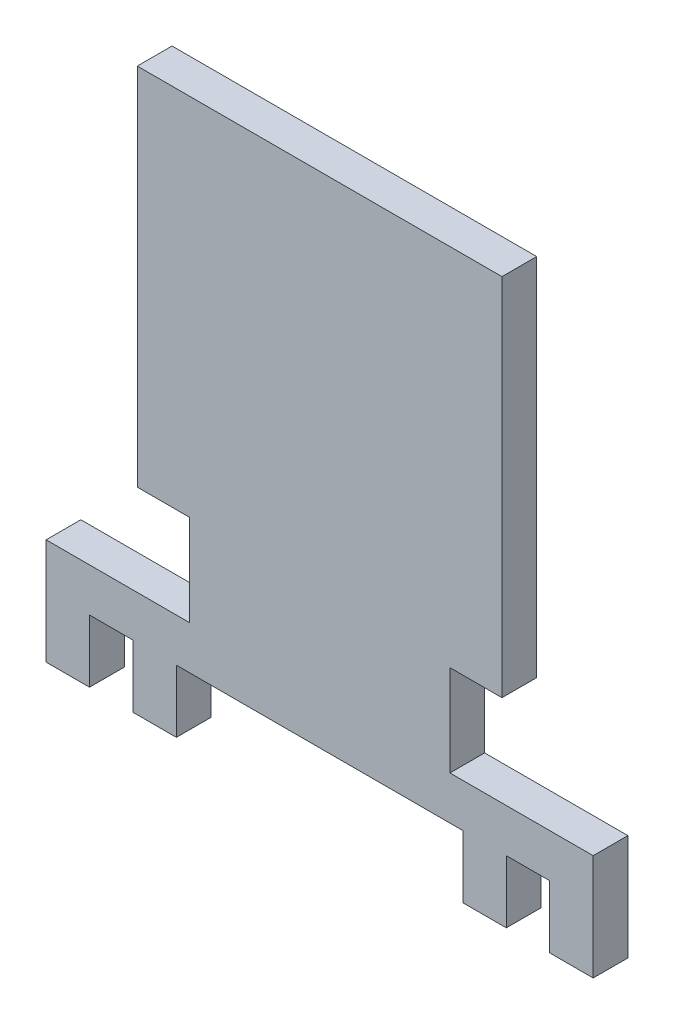
ISO-10303-21;
HEADER;
FILE_DESCRIPTION(('STEP AP214'),'2;1');
FILE_NAME('part.step','',(''),(''),'','','');
FILE_SCHEMA(('AUTOMOTIVE_DESIGN { 1 0 10303 214 1 1 1 1 }'));
ENDSEC;
DATA;
#1=APPLICATION_CONTEXT('core data for automotive mechanical design processes');
#2=APPLICATION_PROTOCOL_DEFINITION('international standard','automotive_design',2000,#1);
#3=PRODUCT_CONTEXT('',#1,'mechanical');
#4=PRODUCT('Part','Part','',(#3));
#5=PRODUCT_RELATED_PRODUCT_CATEGORY('part','',(#4));
#6=PRODUCT_DEFINITION_FORMATION('','',#4);
#7=PRODUCT_DEFINITION_CONTEXT('part definition',#1,'design');
#8=PRODUCT_DEFINITION('design','',#6,#7);
#9=PRODUCT_DEFINITION_SHAPE('','',#8);
#10=(LENGTH_UNIT() NAMED_UNIT(*) SI_UNIT(.MILLI.,.METRE.));
#11=(NAMED_UNIT(*) PLANE_ANGLE_UNIT() SI_UNIT($,.RADIAN.));
#12=(NAMED_UNIT(*) SI_UNIT($,.STERADIAN.) SOLID_ANGLE_UNIT());
#13=UNCERTAINTY_MEASURE_WITH_UNIT(LENGTH_MEASURE(1.E-05),#10,'distance_accuracy_value','');
#14=(GEOMETRIC_REPRESENTATION_CONTEXT(3) GLOBAL_UNCERTAINTY_ASSIGNED_CONTEXT((#13)) GLOBAL_UNIT_ASSIGNED_CONTEXT((#10,
#11,#12)) REPRESENTATION_CONTEXT('',''));
#15=CARTESIAN_POINT('',(0.,0.,0.));
#16=DIRECTION('',(0.,0.,1.));
#17=DIRECTION('',(1.,0.,0.));
#18=AXIS2_PLACEMENT_3D('',#15,#16,#17);
#19=CARTESIAN_POINT('',(-8.28702779116465,-15.9082329317269,5.08));
#20=DIRECTION('',(0.,1.,0.));
#21=DIRECTION('',(-1.,0.,0.));
#22=AXIS2_PLACEMENT_3D('',#19,#20,#21);
#23=PLANE('',#22);
#24=DIRECTION('',(1.,0.,0.));
#25=VECTOR('',#24,1.);
#26=CARTESIAN_POINT('',(-8.28702779116465,-15.9082329317269,5.08));
#27=LINE('',#26,#25);
#28=CARTESIAN_POINT('',(-20.9870277911647,-15.9082329317269,5.08));
#29=VERTEX_POINT('',#28);
#30=CARTESIAN_POINT('',(-14.6370277911647,-15.9082329317269,5.08));
#31=VERTEX_POINT('',#30);
#32=EDGE_CURVE('E348',#29,#31,#27,.T.);
#33=ORIENTED_EDGE('',*,*,#32,.F.);
#34=DIRECTION('',(0.,0.,-1.));
#35=VECTOR('',#34,1.);
#36=CARTESIAN_POINT('',(-20.9870277911647,-15.9082329317269,5.08));
#37=LINE('',#36,#35);
#38=CARTESIAN_POINT('',(-20.9870277911647,-15.9082329317269,0.));
#39=VERTEX_POINT('',#38);
#40=EDGE_CURVE('E264',#29,#39,#37,.T.);
#41=ORIENTED_EDGE('',*,*,#40,.T.);
#42=DIRECTION('',(1.,0.,0.));
#43=VECTOR('',#42,1.);
#44=CARTESIAN_POINT('',(-8.28702779116465,-15.9082329317269,0.));
#45=LINE('',#44,#43);
#46=CARTESIAN_POINT('',(-14.6370277911647,-15.9082329317269,0.));
#47=VERTEX_POINT('',#46);
#48=EDGE_CURVE('E364',#39,#47,#45,.T.);
#49=ORIENTED_EDGE('',*,*,#48,.T.);
#50=DIRECTION('',(0.,0.,-1.));
#51=VECTOR('',#50,1.);
#52=CARTESIAN_POINT('',(-14.6370277911647,-15.9082329317269,5.08));
#53=LINE('',#52,#51);
#54=EDGE_CURVE('E286',#31,#47,#53,.T.);
#55=ORIENTED_EDGE('',*,*,#54,.F.);
#56=EDGE_LOOP('',(#33,#41,#49,#55));
#57=FACE_BOUND('',#56,.T.);
#58=ADVANCED_FACE('F35',(#57),#23,.F.);
#59=CARTESIAN_POINT('',(-81.9368677911647,-15.9082329317269,0.));
#60=VERTEX_POINT('',#59);
#61=CARTESIAN_POINT('',(-75.5868677911647,-15.9082329317269,0.));
#62=VERTEX_POINT('',#61);
#63=EDGE_CURVE('E365',#60,#62,#45,.T.);
#64=ORIENTED_EDGE('',*,*,#63,.T.);
#65=DIRECTION('',(0.,0.,-1.));
#66=VECTOR('',#65,1.);
#67=CARTESIAN_POINT('',(-75.5868677911647,-15.9082329317269,5.08));
#68=LINE('',#67,#66);
#69=CARTESIAN_POINT('',(-75.5868677911647,-15.9082329317269,5.08));
#70=VERTEX_POINT('',#69);
#71=EDGE_CURVE('E304',#70,#62,#68,.T.);
#72=ORIENTED_EDGE('',*,*,#71,.F.);
#73=CARTESIAN_POINT('',(-81.9368677911647,-15.9082329317269,5.08));
#74=VERTEX_POINT('',#73);
#75=EDGE_CURVE('E349',#74,#70,#27,.T.);
#76=ORIENTED_EDGE('',*,*,#75,.F.);
#77=DIRECTION('',(0.,0.,-1.));
#78=VECTOR('',#77,1.);
#79=CARTESIAN_POINT('',(-81.9368677911647,-15.9082329317269,5.08));
#80=LINE('',#79,#78);
#81=EDGE_CURVE('E329',#74,#60,#80,.T.);
#82=ORIENTED_EDGE('',*,*,#81,.T.);
#83=EDGE_LOOP('',(#64,#72,#76,#82));
#84=FACE_BOUND('',#83,.T.);
#85=ADVANCED_FACE('F462',(#84),#23,.F.);
#86=CARTESIAN_POINT('',(-67.3369477911646,-9.5582329317269,5.08));
#87=DIRECTION('',(1.,0.,0.));
#88=DIRECTION('',(0.,0.,-1.));
#89=AXIS2_PLACEMENT_3D('',#86,#87,#88);
#90=PLANE('',#89);
#91=DIRECTION('',(0.,-1.,0.));
#92=VECTOR('',#91,1.);
#93=CARTESIAN_POINT('',(-67.3369477911646,-9.5582329317269,5.08));
#94=LINE('',#93,#92);
#95=CARTESIAN_POINT('',(-67.3369477911646,3.7767670682731,5.08));
#96=VERTEX_POINT('',#95);
#97=CARTESIAN_POINT('',(-67.3369477911646,-9.5582329317269,5.08));
#98=VERTEX_POINT('',#97);
#99=EDGE_CURVE('E58',#96,#98,#94,.T.);
#100=ORIENTED_EDGE('',*,*,#99,.F.);
#101=DIRECTION('',(0.,0.,-1.));
#102=VECTOR('',#101,1.);
#103=CARTESIAN_POINT('',(-67.3369477911646,3.7767670682731,5.08));
#104=LINE('',#103,#102);
#105=CARTESIAN_POINT('',(-67.3369477911646,3.7767670682731,0.));
#106=VERTEX_POINT('',#105);
#107=EDGE_CURVE('E243',#96,#106,#104,.T.);
#108=ORIENTED_EDGE('',*,*,#107,.T.);
#109=DIRECTION('',(0.,-1.,0.));
#110=VECTOR('',#109,1.);
#111=CARTESIAN_POINT('',(-67.3369477911646,-9.5582329317269,0.));
#112=LINE('',#111,#110);
#113=CARTESIAN_POINT('',(-67.3369477911646,-9.5582329317269,0.));
#114=VERTEX_POINT('',#113);
#115=EDGE_CURVE('E337',#106,#114,#112,.T.);
#116=ORIENTED_EDGE('',*,*,#115,.T.);
#117=DIRECTION('',(0.,0.,-1.));
#118=VECTOR('',#117,1.);
#119=CARTESIAN_POINT('',(-67.3369477911646,-9.5582329317269,5.08));
#120=LINE('',#119,#118);
#121=EDGE_CURVE('E11',#98,#114,#120,.T.);
#122=ORIENTED_EDGE('',*,*,#121,.F.);
#123=EDGE_LOOP('',(#100,#108,#116,#122));
#124=FACE_BOUND('',#123,.T.);
#125=ADVANCED_FACE('F37',(#124),#90,.F.);
#126=CARTESIAN_POINT('',(-88.2868677911646,-9.5582329317269,5.08));
#127=DIRECTION('',(0.,-1.,0.));
#128=DIRECTION('',(0.,0.,-1.));
#129=AXIS2_PLACEMENT_3D('',#126,#127,#128);
#130=PLANE('',#129);
#131=DIRECTION('',(-1.,0.,0.));
#132=VECTOR('',#131,1.);
#133=CARTESIAN_POINT('',(-88.2868677911646,-9.5582329317269,0.));
#134=LINE('',#133,#132);
#135=CARTESIAN_POINT('',(-88.2868677911646,-9.5582329317269,0.));
#136=VERTEX_POINT('',#135);
#137=EDGE_CURVE('E360',#114,#136,#134,.T.);
#138=ORIENTED_EDGE('',*,*,#137,.T.);
#139=DIRECTION('',(0.,0.,-1.));
#140=VECTOR('',#139,1.);
#141=CARTESIAN_POINT('',(-88.2868677911646,-9.5582329317269,5.08));
#142=LINE('',#141,#140);
#143=CARTESIAN_POINT('',(-88.2868677911646,-9.5582329317269,5.08));
#144=VERTEX_POINT('',#143);
#145=EDGE_CURVE('E43',#144,#136,#142,.T.);
#146=ORIENTED_EDGE('',*,*,#145,.F.);
#147=DIRECTION('',(-1.,0.,0.));
#148=VECTOR('',#147,1.);
#149=CARTESIAN_POINT('',(-88.2868677911646,-9.5582329317269,5.08));
#150=LINE('',#149,#148);
#151=EDGE_CURVE('E343',#98,#144,#150,.T.);
#152=ORIENTED_EDGE('',*,*,#151,.F.);
#153=ORIENTED_EDGE('',*,*,#121,.T.);
#154=EDGE_LOOP('',(#138,#146,#152,#153));
#155=FACE_BOUND('',#154,.T.);
#156=ADVANCED_FACE('F398',(#155),#130,.F.);
#157=CARTESIAN_POINT('',(-88.2868677911646,-15.9082329317269,5.08));
#158=DIRECTION('',(1.,0.,0.));
#159=DIRECTION('',(0.,0.,-1.));
#160=AXIS2_PLACEMENT_3D('',#157,#158,#159);
#161=PLANE('',#160);
#162=DIRECTION('',(0.,-1.,0.));
#163=VECTOR('',#162,1.);
#164=CARTESIAN_POINT('',(-88.2868677911646,-15.9082329317269,0.));
#165=LINE('',#164,#163);
#166=CARTESIAN_POINT('',(-88.2868677911647,-25.0522329317269,0.));
#167=VERTEX_POINT('',#166);
#168=EDGE_CURVE('E362',#136,#167,#165,.T.);
#169=ORIENTED_EDGE('',*,*,#168,.T.);
#170=DIRECTION('',(0.,0.,-1.));
#171=VECTOR('',#170,1.);
#172=CARTESIAN_POINT('',(-88.2868677911647,-25.0522329317269,5.08));
#173=LINE('',#172,#171);
#174=CARTESIAN_POINT('',(-88.2868677911647,-25.0522329317269,5.08));
#175=VERTEX_POINT('',#174);
#176=EDGE_CURVE('E334',#175,#167,#173,.T.);
#177=ORIENTED_EDGE('',*,*,#176,.F.);
#178=DIRECTION('',(0.,-1.,0.));
#179=VECTOR('',#178,1.);
#180=CARTESIAN_POINT('',(-88.2868677911646,-15.9082329317269,5.08));
#181=LINE('',#180,#179);
#182=EDGE_CURVE('E346',#144,#175,#181,.T.);
#183=ORIENTED_EDGE('',*,*,#182,.F.);
#184=ORIENTED_EDGE('',*,*,#145,.T.);
#185=EDGE_LOOP('',(#169,#177,#183,#184));
#186=FACE_BOUND('',#185,.T.);
#187=ADVANCED_FACE('F382',(#186),#161,.F.);
#188=DIRECTION('',(0.,0.,-1.));
#189=VECTOR('',#188,1.);
#190=CARTESIAN_POINT('',(-27.3370277911647,-15.9082329317269,5.08));
#191=LINE('',#190,#189);
#192=CARTESIAN_POINT('',(-27.3370277911647,-15.9082329317269,5.08));
#193=VERTEX_POINT('',#192);
#194=CARTESIAN_POINT('',(-27.3370277911647,-15.9082329317269,0.));
#195=VERTEX_POINT('',#194);
#196=EDGE_CURVE('E268',#193,#195,#191,.T.);
#197=ORIENTED_EDGE('',*,*,#196,.F.);
#198=CARTESIAN_POINT('',(-69.2368677911646,-15.9082329317269,5.08));
#199=VERTEX_POINT('',#198);
#200=EDGE_CURVE('E353',#199,#193,#27,.T.);
#201=ORIENTED_EDGE('',*,*,#200,.F.);
#202=DIRECTION('',(0.,0.,-1.));
#203=VECTOR('',#202,1.);
#204=CARTESIAN_POINT('',(-69.2368677911646,-15.9082329317269,5.08));
#205=LINE('',#204,#203);
#206=CARTESIAN_POINT('',(-69.2368677911646,-15.9082329317269,0.));
#207=VERTEX_POINT('',#206);
#208=EDGE_CURVE('E317',#199,#207,#205,.T.);
#209=ORIENTED_EDGE('',*,*,#208,.T.);
#210=EDGE_CURVE('E368',#207,#195,#45,.T.);
#211=ORIENTED_EDGE('',*,*,#210,.T.);
#212=EDGE_LOOP('',(#197,#201,#209,#211));
#213=FACE_BOUND('',#212,.T.);
#214=ADVANCED_FACE('F435',(#213),#23,.F.);
#215=CARTESIAN_POINT('',(-8.28702779116464,-9.5582329317269,5.08));
#216=DIRECTION('',(-1.,0.,0.));
#217=DIRECTION('',(0.,-1.,0.));
#218=AXIS2_PLACEMENT_3D('',#215,#216,#217);
#219=PLANE('',#218);
#220=DIRECTION('',(0.,1.,0.));
#221=VECTOR('',#220,1.);
#222=CARTESIAN_POINT('',(-8.28702779116464,-9.5582329317269,0.));
#223=LINE('',#222,#221);
#224=CARTESIAN_POINT('',(-8.28702779116465,-25.0522329317269,0.));
#225=VERTEX_POINT('',#224);
#226=CARTESIAN_POINT('',(-8.28702779116464,-9.5582329317269,0.));
#227=VERTEX_POINT('',#226);
#228=EDGE_CURVE('E367',#225,#227,#223,.T.);
#229=ORIENTED_EDGE('',*,*,#228,.T.);
#230=DIRECTION('',(0.,0.,-1.));
#231=VECTOR('',#230,1.);
#232=CARTESIAN_POINT('',(-8.28702779116464,-9.5582329317269,5.08));
#233=LINE('',#232,#231);
#234=CARTESIAN_POINT('',(-8.28702779116464,-9.5582329317269,5.08));
#235=VERTEX_POINT('',#234);
#236=EDGE_CURVE('E375',#235,#227,#233,.T.);
#237=ORIENTED_EDGE('',*,*,#236,.F.);
#238=DIRECTION('',(0.,1.,0.));
#239=VECTOR('',#238,1.);
#240=CARTESIAN_POINT('',(-8.28702779116464,-9.5582329317269,5.08));
#241=LINE('',#240,#239);
#242=CARTESIAN_POINT('',(-8.28702779116465,-25.0522329317269,5.08));
#243=VERTEX_POINT('',#242);
#244=EDGE_CURVE('E352',#243,#235,#241,.T.);
#245=ORIENTED_EDGE('',*,*,#244,.F.);
#246=DIRECTION('',(0.,0.,-1.));
#247=VECTOR('',#246,1.);
#248=CARTESIAN_POINT('',(-8.28702779116465,-25.0522329317269,5.08));
#249=LINE('',#248,#247);
#250=EDGE_CURVE('E281',#243,#225,#249,.T.);
#251=ORIENTED_EDGE('',*,*,#250,.T.);
#252=EDGE_LOOP('',(#229,#237,#245,#251));
#253=FACE_BOUND('',#252,.T.);
#254=ADVANCED_FACE('F419',(#253),#219,.F.);
#255=CARTESIAN_POINT('',(-29.2369477911646,-9.55823293172691,5.08));
#256=DIRECTION('',(0.,-1.,0.));
#257=DIRECTION('',(1.,0.,0.));
#258=AXIS2_PLACEMENT_3D('',#255,#256,#257);
#259=PLANE('',#258);
#260=DIRECTION('',(-1.,0.,0.));
#261=VECTOR('',#260,1.);
#262=CARTESIAN_POINT('',(-29.2369477911646,-9.55823293172691,0.));
#263=LINE('',#262,#261);
#264=CARTESIAN_POINT('',(-29.2369477911646,-9.55823293172691,0.));
#265=VERTEX_POINT('',#264);
#266=EDGE_CURVE('E370',#227,#265,#263,.T.);
#267=ORIENTED_EDGE('',*,*,#266,.T.);
#268=DIRECTION('',(0.,0.,-1.));
#269=VECTOR('',#268,1.);
#270=CARTESIAN_POINT('',(-29.2369477911646,-9.55823293172691,5.08));
#271=LINE('',#270,#269);
#272=CARTESIAN_POINT('',(-29.2369477911646,-9.55823293172691,5.08));
#273=VERTEX_POINT('',#272);
#274=EDGE_CURVE('E358',#273,#265,#271,.T.);
#275=ORIENTED_EDGE('',*,*,#274,.F.);
#276=DIRECTION('',(-1.,0.,0.));
#277=VECTOR('',#276,1.);
#278=CARTESIAN_POINT('',(-29.2369477911646,-9.55823293172691,5.08));
#279=LINE('',#278,#277);
#280=EDGE_CURVE('E355',#235,#273,#279,.T.);
#281=ORIENTED_EDGE('',*,*,#280,.F.);
#282=ORIENTED_EDGE('',*,*,#236,.T.);
#283=EDGE_LOOP('',(#267,#275,#281,#282));
#284=FACE_BOUND('',#283,.T.);
#285=ADVANCED_FACE('F416',(#284),#259,.F.);
#286=CARTESIAN_POINT('',(-29.2369477911646,30.4417670682731,5.08));
#287=DIRECTION('',(-1.,0.,0.));
#288=DIRECTION('',(0.,0.,1.));
#289=AXIS2_PLACEMENT_3D('',#286,#287,#288);
#290=PLANE('',#289);
#291=DIRECTION('',(0.,1.,0.));
#292=VECTOR('',#291,1.);
#293=CARTESIAN_POINT('',(-29.2369477911646,30.4417670682731,0.));
#294=LINE('',#293,#292);
#295=CARTESIAN_POINT('',(-29.2369477911646,3.7767670682731,0.));
#296=VERTEX_POINT('',#295);
#297=EDGE_CURVE('E344',#265,#296,#294,.T.);
#298=ORIENTED_EDGE('',*,*,#297,.T.);
#299=DIRECTION('',(0.,0.,1.));
#300=VECTOR('',#299,1.);
#301=CARTESIAN_POINT('',(-29.2369477911646,3.7767670682731,5.08));
#302=LINE('',#301,#300);
#303=CARTESIAN_POINT('',(-29.2369477911646,3.7767670682731,5.08));
#304=VERTEX_POINT('',#303);
#305=EDGE_CURVE('E50',#296,#304,#302,.T.);
#306=ORIENTED_EDGE('',*,*,#305,.T.);
#307=DIRECTION('',(0.,1.,0.));
#308=VECTOR('',#307,1.);
#309=CARTESIAN_POINT('',(-29.2369477911646,30.4417670682731,5.08));
#310=LINE('',#309,#308);
#311=EDGE_CURVE('E216',#273,#304,#310,.T.);
#312=ORIENTED_EDGE('',*,*,#311,.F.);
#313=ORIENTED_EDGE('',*,*,#274,.T.);
#314=EDGE_LOOP('',(#298,#306,#312,#313));
#315=FACE_BOUND('',#314,.T.);
#316=ADVANCED_FACE('F412',(#315),#290,.F.);
#317=CARTESIAN_POINT('',(0.,0.,5.08));
#318=DIRECTION('',(0.,0.,-1.));
#319=DIRECTION('',(-1.,0.,0.));
#320=AXIS2_PLACEMENT_3D('',#317,#318,#319);
#321=PLANE('',#320);
#322=ORIENTED_EDGE('',*,*,#200,.T.);
#323=DIRECTION('',(0.,1.,0.));
#324=VECTOR('',#323,1.);
#325=CARTESIAN_POINT('',(-27.3370277911647,-15.9082329317269,5.08));
#326=LINE('',#325,#324);
#327=CARTESIAN_POINT('',(-27.3370277911647,-25.0522329317269,5.08));
#328=VERTEX_POINT('',#327);
#329=EDGE_CURVE('E253',#328,#193,#326,.T.);
#330=ORIENTED_EDGE('',*,*,#329,.F.);
#331=DIRECTION('',(-1.,0.,0.));
#332=VECTOR('',#331,1.);
#333=CARTESIAN_POINT('',(-20.9870277911647,-25.0522329317269,5.08));
#334=LINE('',#333,#332);
#335=CARTESIAN_POINT('',(-20.9870277911647,-25.0522329317269,5.08));
#336=VERTEX_POINT('',#335);
#337=EDGE_CURVE('E249',#336,#328,#334,.T.);
#338=ORIENTED_EDGE('',*,*,#337,.F.);
#339=DIRECTION('',(0.,-1.,0.));
#340=VECTOR('',#339,1.);
#341=CARTESIAN_POINT('',(-20.9870277911647,-15.9082329317269,5.08));
#342=LINE('',#341,#340);
#343=EDGE_CURVE('E246',#29,#336,#342,.T.);
#344=ORIENTED_EDGE('',*,*,#343,.F.);
#345=ORIENTED_EDGE('',*,*,#32,.T.);
#346=DIRECTION('',(0.,1.,0.));
#347=VECTOR('',#346,1.);
#348=CARTESIAN_POINT('',(-14.6370277911647,-15.9082329317269,5.08));
#349=LINE('',#348,#347);
#350=CARTESIAN_POINT('',(-14.6370277911647,-25.0522329317269,5.08));
#351=VERTEX_POINT('',#350);
#352=EDGE_CURVE('E277',#351,#31,#349,.T.);
#353=ORIENTED_EDGE('',*,*,#352,.F.);
#354=DIRECTION('',(-1.,0.,0.));
#355=VECTOR('',#354,1.);
#356=CARTESIAN_POINT('',(-8.28702779116465,-25.0522329317269,5.08));
#357=LINE('',#356,#355);
#358=EDGE_CURVE('E274',#243,#351,#357,.T.);
#359=ORIENTED_EDGE('',*,*,#358,.F.);
#360=ORIENTED_EDGE('',*,*,#244,.T.);
#361=ORIENTED_EDGE('',*,*,#280,.T.);
#362=ORIENTED_EDGE('',*,*,#311,.T.);
#363=DIRECTION('',(-1.,0.,0.));
#364=VECTOR('',#363,1.);
#365=CARTESIAN_POINT('',(-74.9519477911646,3.7767670682731,5.08));
#366=LINE('',#365,#364);
#367=CARTESIAN_POINT('',(-21.6219477911646,3.7767670682731,5.08));
#368=VERTEX_POINT('',#367);
#369=EDGE_CURVE('E200',#368,#304,#366,.T.);
#370=ORIENTED_EDGE('',*,*,#369,.F.);
#371=DIRECTION('',(0.,-1.,0.));
#372=VECTOR('',#371,1.);
#373=CARTESIAN_POINT('',(-21.6219477911646,57.1067670682731,5.08));
#374=LINE('',#373,#372);
#375=CARTESIAN_POINT('',(-21.6219477911646,57.1067670682731,5.08));
#376=VERTEX_POINT('',#375);
#377=EDGE_CURVE('E214',#376,#368,#374,.T.);
#378=ORIENTED_EDGE('',*,*,#377,.F.);
#379=DIRECTION('',(1.,0.,0.));
#380=VECTOR('',#379,1.);
#381=CARTESIAN_POINT('',(-74.9519477911646,57.1067670682731,5.08));
#382=LINE('',#381,#380);
#383=CARTESIAN_POINT('',(-74.9519477911646,57.1067670682731,5.08));
#384=VERTEX_POINT('',#383);
#385=EDGE_CURVE('E208',#384,#376,#382,.T.);
#386=ORIENTED_EDGE('',*,*,#385,.F.);
#387=DIRECTION('',(0.,1.,0.));
#388=VECTOR('',#387,1.);
#389=CARTESIAN_POINT('',(-74.9519477911646,57.1067670682731,5.08));
#390=LINE('',#389,#388);
#391=CARTESIAN_POINT('',(-74.9519477911646,3.7767670682731,5.08));
#392=VERTEX_POINT('',#391);
#393=EDGE_CURVE('E217',#392,#384,#390,.T.);
#394=ORIENTED_EDGE('',*,*,#393,.F.);
#395=EDGE_CURVE('E218',#96,#392,#366,.T.);
#396=ORIENTED_EDGE('',*,*,#395,.F.);
#397=ORIENTED_EDGE('',*,*,#99,.T.);
#398=ORIENTED_EDGE('',*,*,#151,.T.);
#399=ORIENTED_EDGE('',*,*,#182,.T.);
#400=DIRECTION('',(-1.,0.,0.));
#401=VECTOR('',#400,1.);
#402=CARTESIAN_POINT('',(-88.2868677911647,-25.0522329317269,5.08));
#403=LINE('',#402,#401);
#404=CARTESIAN_POINT('',(-81.9368677911647,-25.0522329317269,5.08));
#405=VERTEX_POINT('',#404);
#406=EDGE_CURVE('E325',#405,#175,#403,.T.);
#407=ORIENTED_EDGE('',*,*,#406,.F.);
#408=DIRECTION('',(0.,-1.,0.));
#409=VECTOR('',#408,1.);
#410=CARTESIAN_POINT('',(-81.9368677911647,-15.9082329317269,5.08));
#411=LINE('',#410,#409);
#412=EDGE_CURVE('E322',#74,#405,#411,.T.);
#413=ORIENTED_EDGE('',*,*,#412,.F.);
#414=ORIENTED_EDGE('',*,*,#75,.T.);
#415=DIRECTION('',(0.,1.,0.));
#416=VECTOR('',#415,1.);
#417=CARTESIAN_POINT('',(-75.5868677911647,-15.9082329317269,5.08));
#418=LINE('',#417,#416);
#419=CARTESIAN_POINT('',(-75.5868677911647,-25.0522329317269,5.08));
#420=VERTEX_POINT('',#419);
#421=EDGE_CURVE('E294',#420,#70,#418,.T.);
#422=ORIENTED_EDGE('',*,*,#421,.F.);
#423=DIRECTION('',(-1.,0.,0.));
#424=VECTOR('',#423,1.);
#425=CARTESIAN_POINT('',(-75.5868677911647,-25.0522329317269,5.08));
#426=LINE('',#425,#424);
#427=CARTESIAN_POINT('',(-69.2368677911646,-25.0522329317269,5.08));
#428=VERTEX_POINT('',#427);
#429=EDGE_CURVE('E301',#428,#420,#426,.T.);
#430=ORIENTED_EDGE('',*,*,#429,.F.);
#431=DIRECTION('',(0.,-1.,0.));
#432=VECTOR('',#431,1.);
#433=CARTESIAN_POINT('',(-69.2368677911646,-15.9082329317269,5.08));
#434=LINE('',#433,#432);
#435=EDGE_CURVE('E297',#199,#428,#434,.T.);
#436=ORIENTED_EDGE('',*,*,#435,.F.);
#437=EDGE_LOOP('',(#322,#330,#338,#344,#345,#353,#359,#360,#361,#362,#370,#378,#386,#394,#396,
#397,#398,#399,#407,#413,#414,#422,#430,#436));
#438=FACE_BOUND('',#437,.T.);
#439=ADVANCED_FACE('F212',(#438),#321,.F.);
#440=CARTESIAN_POINT('',(0.,0.,0.));
#441=DIRECTION('',(0.,0.,-1.));
#442=DIRECTION('',(-1.,0.,0.));
#443=AXIS2_PLACEMENT_3D('',#440,#441,#442);
#444=PLANE('',#443);
#445=DIRECTION('',(0.,1.,0.));
#446=VECTOR('',#445,1.);
#447=CARTESIAN_POINT('',(-27.3370277911647,-15.9082329317269,0.));
#448=LINE('',#447,#446);
#449=CARTESIAN_POINT('',(-27.3370277911647,-25.0522329317269,0.));
#450=VERTEX_POINT('',#449);
#451=EDGE_CURVE('E250',#450,#195,#448,.T.);
#452=ORIENTED_EDGE('',*,*,#451,.T.);
#453=ORIENTED_EDGE('',*,*,#210,.F.);
#454=DIRECTION('',(0.,-1.,0.));
#455=VECTOR('',#454,1.);
#456=CARTESIAN_POINT('',(-69.2368677911646,-15.9082329317269,0.));
#457=LINE('',#456,#455);
#458=CARTESIAN_POINT('',(-69.2368677911646,-25.0522329317269,0.));
#459=VERTEX_POINT('',#458);
#460=EDGE_CURVE('E307',#207,#459,#457,.T.);
#461=ORIENTED_EDGE('',*,*,#460,.T.);
#462=DIRECTION('',(-1.,0.,0.));
#463=VECTOR('',#462,1.);
#464=CARTESIAN_POINT('',(-75.5868677911647,-25.0522329317269,0.));
#465=LINE('',#464,#463);
#466=CARTESIAN_POINT('',(-75.5868677911647,-25.0522329317269,0.));
#467=VERTEX_POINT('',#466);
#468=EDGE_CURVE('E298',#459,#467,#465,.T.);
#469=ORIENTED_EDGE('',*,*,#468,.T.);
#470=DIRECTION('',(0.,1.,0.));
#471=VECTOR('',#470,1.);
#472=CARTESIAN_POINT('',(-75.5868677911647,-15.9082329317269,0.));
#473=LINE('',#472,#471);
#474=EDGE_CURVE('E289',#467,#62,#473,.T.);
#475=ORIENTED_EDGE('',*,*,#474,.T.);
#476=ORIENTED_EDGE('',*,*,#63,.F.);
#477=DIRECTION('',(0.,-1.,0.));
#478=VECTOR('',#477,1.);
#479=CARTESIAN_POINT('',(-81.9368677911647,-15.9082329317269,0.));
#480=LINE('',#479,#478);
#481=CARTESIAN_POINT('',(-81.9368677911647,-25.0522329317269,0.));
#482=VERTEX_POINT('',#481);
#483=EDGE_CURVE('E314',#60,#482,#480,.T.);
#484=ORIENTED_EDGE('',*,*,#483,.T.);
#485=DIRECTION('',(-1.,0.,0.));
#486=VECTOR('',#485,1.);
#487=CARTESIAN_POINT('',(-88.2868677911647,-25.0522329317269,0.));
#488=LINE('',#487,#486);
#489=EDGE_CURVE('E326',#482,#167,#488,.T.);
#490=ORIENTED_EDGE('',*,*,#489,.T.);
#491=ORIENTED_EDGE('',*,*,#168,.F.);
#492=ORIENTED_EDGE('',*,*,#137,.F.);
#493=ORIENTED_EDGE('',*,*,#115,.F.);
#494=DIRECTION('',(-1.,0.,0.));
#495=VECTOR('',#494,1.);
#496=CARTESIAN_POINT('',(-74.9519477911646,3.7767670682731,0.));
#497=LINE('',#496,#495);
#498=CARTESIAN_POINT('',(-74.9519477911646,3.7767670682731,0.));
#499=VERTEX_POINT('',#498);
#500=EDGE_CURVE('E233',#106,#499,#497,.T.);
#501=ORIENTED_EDGE('',*,*,#500,.T.);
#502=DIRECTION('',(0.,1.,0.));
#503=VECTOR('',#502,1.);
#504=CARTESIAN_POINT('',(-74.9519477911646,57.1067670682731,0.));
#505=LINE('',#504,#503);
#506=CARTESIAN_POINT('',(-74.9519477911646,57.1067670682731,0.));
#507=VERTEX_POINT('',#506);
#508=EDGE_CURVE('E225',#499,#507,#505,.T.);
#509=ORIENTED_EDGE('',*,*,#508,.T.);
#510=DIRECTION('',(1.,0.,0.));
#511=VECTOR('',#510,1.);
#512=CARTESIAN_POINT('',(-74.9519477911646,57.1067670682731,0.));
#513=LINE('',#512,#511);
#514=CARTESIAN_POINT('',(-21.6219477911646,57.1067670682731,0.));
#515=VERTEX_POINT('',#514);
#516=EDGE_CURVE('E222',#507,#515,#513,.T.);
#517=ORIENTED_EDGE('',*,*,#516,.T.);
#518=DIRECTION('',(0.,-1.,0.));
#519=VECTOR('',#518,1.);
#520=CARTESIAN_POINT('',(-21.6219477911646,57.1067670682731,0.));
#521=LINE('',#520,#519);
#522=CARTESIAN_POINT('',(-21.6219477911646,3.7767670682731,0.));
#523=VERTEX_POINT('',#522);
#524=EDGE_CURVE('E231',#515,#523,#521,.T.);
#525=ORIENTED_EDGE('',*,*,#524,.T.);
#526=EDGE_CURVE('E202',#523,#296,#497,.T.);
#527=ORIENTED_EDGE('',*,*,#526,.T.);
#528=ORIENTED_EDGE('',*,*,#297,.F.);
#529=ORIENTED_EDGE('',*,*,#266,.F.);
#530=ORIENTED_EDGE('',*,*,#228,.F.);
#531=DIRECTION('',(-1.,0.,0.));
#532=VECTOR('',#531,1.);
#533=CARTESIAN_POINT('',(-8.28702779116465,-25.0522329317269,0.));
#534=LINE('',#533,#532);
#535=CARTESIAN_POINT('',(-14.6370277911647,-25.0522329317269,0.));
#536=VERTEX_POINT('',#535);
#537=EDGE_CURVE('E267',#225,#536,#534,.T.);
#538=ORIENTED_EDGE('',*,*,#537,.T.);
#539=DIRECTION('',(0.,1.,0.));
#540=VECTOR('',#539,1.);
#541=CARTESIAN_POINT('',(-14.6370277911647,-15.9082329317269,0.));
#542=LINE('',#541,#540);
#543=EDGE_CURVE('E278',#536,#47,#542,.T.);
#544=ORIENTED_EDGE('',*,*,#543,.T.);
#545=ORIENTED_EDGE('',*,*,#48,.F.);
#546=DIRECTION('',(0.,-1.,0.));
#547=VECTOR('',#546,1.);
#548=CARTESIAN_POINT('',(-20.9870277911647,-15.9082329317269,0.));
#549=LINE('',#548,#547);
#550=CARTESIAN_POINT('',(-20.9870277911647,-25.0522329317269,0.));
#551=VERTEX_POINT('',#550);
#552=EDGE_CURVE('E245',#39,#551,#549,.T.);
#553=ORIENTED_EDGE('',*,*,#552,.T.);
#554=DIRECTION('',(-1.,0.,0.));
#555=VECTOR('',#554,1.);
#556=CARTESIAN_POINT('',(-20.9870277911647,-25.0522329317269,0.));
#557=LINE('',#556,#555);
#558=EDGE_CURVE('E259',#551,#450,#557,.T.);
#559=ORIENTED_EDGE('',*,*,#558,.T.);
#560=EDGE_LOOP('',(#452,#453,#461,#469,#475,#476,#484,#490,#491,#492,#493,#501,#509,#517,#525,
#527,#528,#529,#530,#538,#544,#545,#553,#559));
#561=FACE_BOUND('',#560,.T.);
#562=ADVANCED_FACE('F388',(#561),#444,.T.);
#563=CARTESIAN_POINT('',(-88.2868677911647,-25.0522329317269,5.08));
#564=DIRECTION('',(0.,-1.,0.));
#565=DIRECTION('',(0.,0.,-1.));
#566=AXIS2_PLACEMENT_3D('',#563,#564,#565);
#567=PLANE('',#566);
#568=ORIENTED_EDGE('',*,*,#489,.F.);
#569=DIRECTION('',(0.,0.,-1.));
#570=VECTOR('',#569,1.);
#571=CARTESIAN_POINT('',(-81.9368677911647,-25.0522329317269,5.08));
#572=LINE('',#571,#570);
#573=EDGE_CURVE('E338',#405,#482,#572,.T.);
#574=ORIENTED_EDGE('',*,*,#573,.F.);
#575=ORIENTED_EDGE('',*,*,#406,.T.);
#576=ORIENTED_EDGE('',*,*,#176,.T.);
#577=EDGE_LOOP('',(#568,#574,#575,#576));
#578=FACE_BOUND('',#577,.T.);
#579=ADVANCED_FACE('F393',(#578),#567,.T.);
#580=CARTESIAN_POINT('',(-81.9368677911647,-15.9082329317269,5.08));
#581=DIRECTION('',(1.,0.,0.));
#582=DIRECTION('',(0.,0.,-1.));
#583=AXIS2_PLACEMENT_3D('',#580,#581,#582);
#584=PLANE('',#583);
#585=ORIENTED_EDGE('',*,*,#483,.F.);
#586=ORIENTED_EDGE('',*,*,#81,.F.);
#587=ORIENTED_EDGE('',*,*,#412,.T.);
#588=ORIENTED_EDGE('',*,*,#573,.T.);
#589=EDGE_LOOP('',(#585,#586,#587,#588));
#590=FACE_BOUND('',#589,.T.);
#591=ADVANCED_FACE('F517',(#590),#584,.T.);
#592=CARTESIAN_POINT('',(-75.5868677911647,-15.9082329317269,5.08));
#593=DIRECTION('',(-1.,0.,0.));
#594=DIRECTION('',(0.,-1.,0.));
#595=AXIS2_PLACEMENT_3D('',#592,#593,#594);
#596=PLANE('',#595);
#597=ORIENTED_EDGE('',*,*,#474,.F.);
#598=DIRECTION('',(0.,0.,-1.));
#599=VECTOR('',#598,1.);
#600=CARTESIAN_POINT('',(-75.5868677911647,-25.0522329317269,5.08));
#601=LINE('',#600,#599);
#602=EDGE_CURVE('E312',#420,#467,#601,.T.);
#603=ORIENTED_EDGE('',*,*,#602,.F.);
#604=ORIENTED_EDGE('',*,*,#421,.T.);
#605=ORIENTED_EDGE('',*,*,#71,.T.);
#606=EDGE_LOOP('',(#597,#603,#604,#605));
#607=FACE_BOUND('',#606,.T.);
#608=ADVANCED_FACE('F528',(#607),#596,.T.);
#609=CARTESIAN_POINT('',(-75.5868677911647,-25.0522329317269,5.08));
#610=DIRECTION('',(0.,-1.,0.));
#611=DIRECTION('',(0.,0.,-1.));
#612=AXIS2_PLACEMENT_3D('',#609,#610,#611);
#613=PLANE('',#612);
#614=ORIENTED_EDGE('',*,*,#468,.F.);
#615=DIRECTION('',(0.,0.,-1.));
#616=VECTOR('',#615,1.);
#617=CARTESIAN_POINT('',(-69.2368677911646,-25.0522329317269,5.08));
#618=LINE('',#617,#616);
#619=EDGE_CURVE('E315',#428,#459,#618,.T.);
#620=ORIENTED_EDGE('',*,*,#619,.F.);
#621=ORIENTED_EDGE('',*,*,#429,.T.);
#622=ORIENTED_EDGE('',*,*,#602,.T.);
#623=EDGE_LOOP('',(#614,#620,#621,#622));
#624=FACE_BOUND('',#623,.T.);
#625=ADVANCED_FACE('F538',(#624),#613,.T.);
#626=CARTESIAN_POINT('',(-69.2368677911646,-15.9082329317269,5.08));
#627=DIRECTION('',(1.,0.,0.));
#628=DIRECTION('',(0.,0.,-1.));
#629=AXIS2_PLACEMENT_3D('',#626,#627,#628);
#630=PLANE('',#629);
#631=ORIENTED_EDGE('',*,*,#460,.F.);
#632=ORIENTED_EDGE('',*,*,#208,.F.);
#633=ORIENTED_EDGE('',*,*,#435,.T.);
#634=ORIENTED_EDGE('',*,*,#619,.T.);
#635=EDGE_LOOP('',(#631,#632,#633,#634));
#636=FACE_BOUND('',#635,.T.);
#637=ADVANCED_FACE('F548',(#636),#630,.T.);
#638=CARTESIAN_POINT('',(-14.6370277911647,-15.9082329317269,5.08));
#639=DIRECTION('',(-1.,0.,0.));
#640=DIRECTION('',(0.,0.,1.));
#641=AXIS2_PLACEMENT_3D('',#638,#639,#640);
#642=PLANE('',#641);
#643=ORIENTED_EDGE('',*,*,#543,.F.);
#644=DIRECTION('',(0.,0.,-1.));
#645=VECTOR('',#644,1.);
#646=CARTESIAN_POINT('',(-14.6370277911647,-25.0522329317269,5.08));
#647=LINE('',#646,#645);
#648=EDGE_CURVE('E290',#351,#536,#647,.T.);
#649=ORIENTED_EDGE('',*,*,#648,.F.);
#650=ORIENTED_EDGE('',*,*,#352,.T.);
#651=ORIENTED_EDGE('',*,*,#54,.T.);
#652=EDGE_LOOP('',(#643,#649,#650,#651));
#653=FACE_BOUND('',#652,.T.);
#654=ADVANCED_FACE('F428',(#653),#642,.T.);
#655=CARTESIAN_POINT('',(-8.28702779116465,-25.0522329317269,5.08));
#656=DIRECTION('',(0.,-1.,0.));
#657=DIRECTION('',(0.,0.,-1.));
#658=AXIS2_PLACEMENT_3D('',#655,#656,#657);
#659=PLANE('',#658);
#660=ORIENTED_EDGE('',*,*,#537,.F.);
#661=ORIENTED_EDGE('',*,*,#250,.F.);
#662=ORIENTED_EDGE('',*,*,#358,.T.);
#663=ORIENTED_EDGE('',*,*,#648,.T.);
#664=EDGE_LOOP('',(#660,#661,#662,#663));
#665=FACE_BOUND('',#664,.T.);
#666=ADVANCED_FACE('F424',(#665),#659,.T.);
#667=CARTESIAN_POINT('',(-20.9870277911647,-15.9082329317269,5.08));
#668=DIRECTION('',(1.,0.,0.));
#669=DIRECTION('',(0.,1.,0.));
#670=AXIS2_PLACEMENT_3D('',#667,#668,#669);
#671=PLANE('',#670);
#672=ORIENTED_EDGE('',*,*,#552,.F.);
#673=ORIENTED_EDGE('',*,*,#40,.F.);
#674=ORIENTED_EDGE('',*,*,#343,.T.);
#675=DIRECTION('',(0.,0.,-1.));
#676=VECTOR('',#675,1.);
#677=CARTESIAN_POINT('',(-20.9870277911647,-25.0522329317269,5.08));
#678=LINE('',#677,#676);
#679=EDGE_CURVE('E256',#336,#551,#678,.T.);
#680=ORIENTED_EDGE('',*,*,#679,.T.);
#681=EDGE_LOOP('',(#672,#673,#674,#680));
#682=FACE_BOUND('',#681,.T.);
#683=ADVANCED_FACE('F450',(#682),#671,.T.);
#684=CARTESIAN_POINT('',(-27.3370277911647,-15.9082329317269,5.08));
#685=DIRECTION('',(-1.,0.,0.));
#686=DIRECTION('',(0.,0.,1.));
#687=AXIS2_PLACEMENT_3D('',#684,#685,#686);
#688=PLANE('',#687);
#689=ORIENTED_EDGE('',*,*,#451,.F.);
#690=DIRECTION('',(0.,0.,-1.));
#691=VECTOR('',#690,1.);
#692=CARTESIAN_POINT('',(-27.3370277911647,-25.0522329317269,5.08));
#693=LINE('',#692,#691);
#694=EDGE_CURVE('E271',#328,#450,#693,.T.);
#695=ORIENTED_EDGE('',*,*,#694,.F.);
#696=ORIENTED_EDGE('',*,*,#329,.T.);
#697=ORIENTED_EDGE('',*,*,#196,.T.);
#698=EDGE_LOOP('',(#689,#695,#696,#697));
#699=FACE_BOUND('',#698,.T.);
#700=ADVANCED_FACE('F440',(#699),#688,.T.);
#701=CARTESIAN_POINT('',(-20.9870277911647,-25.0522329317269,5.08));
#702=DIRECTION('',(0.,-1.,0.));
#703=DIRECTION('',(1.,0.,0.));
#704=AXIS2_PLACEMENT_3D('',#701,#702,#703);
#705=PLANE('',#704);
#706=ORIENTED_EDGE('',*,*,#558,.F.);
#707=ORIENTED_EDGE('',*,*,#679,.F.);
#708=ORIENTED_EDGE('',*,*,#337,.T.);
#709=ORIENTED_EDGE('',*,*,#694,.T.);
#710=EDGE_LOOP('',(#706,#707,#708,#709));
#711=FACE_BOUND('',#710,.T.);
#712=ADVANCED_FACE('F444',(#711),#705,.T.);
#713=CARTESIAN_POINT('',(-74.9519477911646,3.7767670682731,5.08));
#714=DIRECTION('',(0.,-1.,0.));
#715=DIRECTION('',(1.,0.,0.));
#716=AXIS2_PLACEMENT_3D('',#713,#714,#715);
#717=PLANE('',#716);
#718=ORIENTED_EDGE('',*,*,#107,.F.);
#719=ORIENTED_EDGE('',*,*,#395,.T.);
#720=DIRECTION('',(0.,0.,-1.));
#721=VECTOR('',#720,1.);
#722=CARTESIAN_POINT('',(-74.9519477911646,3.7767670682731,5.08));
#723=LINE('',#722,#721);
#724=EDGE_CURVE('E207',#392,#499,#723,.T.);
#725=ORIENTED_EDGE('',*,*,#724,.T.);
#726=ORIENTED_EDGE('',*,*,#500,.F.);
#727=EDGE_LOOP('',(#718,#719,#725,#726));
#728=FACE_BOUND('',#727,.T.);
#729=ADVANCED_FACE('F401',(#728),#717,.T.);
#730=ORIENTED_EDGE('',*,*,#305,.F.);
#731=ORIENTED_EDGE('',*,*,#526,.F.);
#732=DIRECTION('',(0.,0.,-1.));
#733=VECTOR('',#732,1.);
#734=CARTESIAN_POINT('',(-21.6219477911646,3.7767670682731,5.08));
#735=LINE('',#734,#733);
#736=EDGE_CURVE('E197',#368,#523,#735,.T.);
#737=ORIENTED_EDGE('',*,*,#736,.F.);
#738=ORIENTED_EDGE('',*,*,#369,.T.);
#739=EDGE_LOOP('',(#730,#731,#737,#738));
#740=FACE_BOUND('',#739,.T.);
#741=ADVANCED_FACE('F199',(#740),#717,.T.);
#742=CARTESIAN_POINT('',(-21.6219477911646,57.1067670682731,5.08));
#743=DIRECTION('',(1.,0.,0.));
#744=DIRECTION('',(0.,1.,0.));
#745=AXIS2_PLACEMENT_3D('',#742,#743,#744);
#746=PLANE('',#745);
#747=ORIENTED_EDGE('',*,*,#524,.F.);
#748=DIRECTION('',(0.,0.,-1.));
#749=VECTOR('',#748,1.);
#750=CARTESIAN_POINT('',(-21.6219477911646,57.1067670682731,5.08));
#751=LINE('',#750,#749);
#752=EDGE_CURVE('E221',#376,#515,#751,.T.);
#753=ORIENTED_EDGE('',*,*,#752,.F.);
#754=ORIENTED_EDGE('',*,*,#377,.T.);
#755=ORIENTED_EDGE('',*,*,#736,.T.);
#756=EDGE_LOOP('',(#747,#753,#754,#755));
#757=FACE_BOUND('',#756,.T.);
#758=ADVANCED_FACE('F220',(#757),#746,.T.);
#759=CARTESIAN_POINT('',(-74.9519477911646,57.1067670682731,5.08));
#760=DIRECTION('',(0.,1.,0.));
#761=DIRECTION('',(-1.,0.,0.));
#762=AXIS2_PLACEMENT_3D('',#759,#760,#761);
#763=PLANE('',#762);
#764=ORIENTED_EDGE('',*,*,#516,.F.);
#765=DIRECTION('',(0.,0.,-1.));
#766=VECTOR('',#765,1.);
#767=CARTESIAN_POINT('',(-74.9519477911646,57.1067670682731,5.08));
#768=LINE('',#767,#766);
#769=EDGE_CURVE('E238',#384,#507,#768,.T.);
#770=ORIENTED_EDGE('',*,*,#769,.F.);
#771=ORIENTED_EDGE('',*,*,#385,.T.);
#772=ORIENTED_EDGE('',*,*,#752,.T.);
#773=EDGE_LOOP('',(#764,#770,#771,#772));
#774=FACE_BOUND('',#773,.T.);
#775=ADVANCED_FACE('F409',(#774),#763,.T.);
#776=CARTESIAN_POINT('',(-74.9519477911646,57.1067670682731,5.08));
#777=DIRECTION('',(-1.,0.,0.));
#778=DIRECTION('',(0.,-1.,0.));
#779=AXIS2_PLACEMENT_3D('',#776,#777,#778);
#780=PLANE('',#779);
#781=ORIENTED_EDGE('',*,*,#508,.F.);
#782=ORIENTED_EDGE('',*,*,#724,.F.);
#783=ORIENTED_EDGE('',*,*,#393,.T.);
#784=ORIENTED_EDGE('',*,*,#769,.T.);
#785=EDGE_LOOP('',(#781,#782,#783,#784));
#786=FACE_BOUND('',#785,.T.);
#787=ADVANCED_FACE('F406',(#786),#780,.T.);
#788=CLOSED_SHELL('',(#58,#85,#125,#156,#187,#214,#254,#285,#316,#439,#562,#579,#591,#608,#625,
#637,#654,#666,#683,#700,#712,#729,#741,#758,#775,#787));
#789=MANIFOLD_SOLID_BREP('B2',#788);
#790=ADVANCED_BREP_SHAPE_REPRESENTATION('',(#18,#789),#14);
#791=SHAPE_DEFINITION_REPRESENTATION(#9,#790);
ENDSEC;
END-ISO-10303-21;
